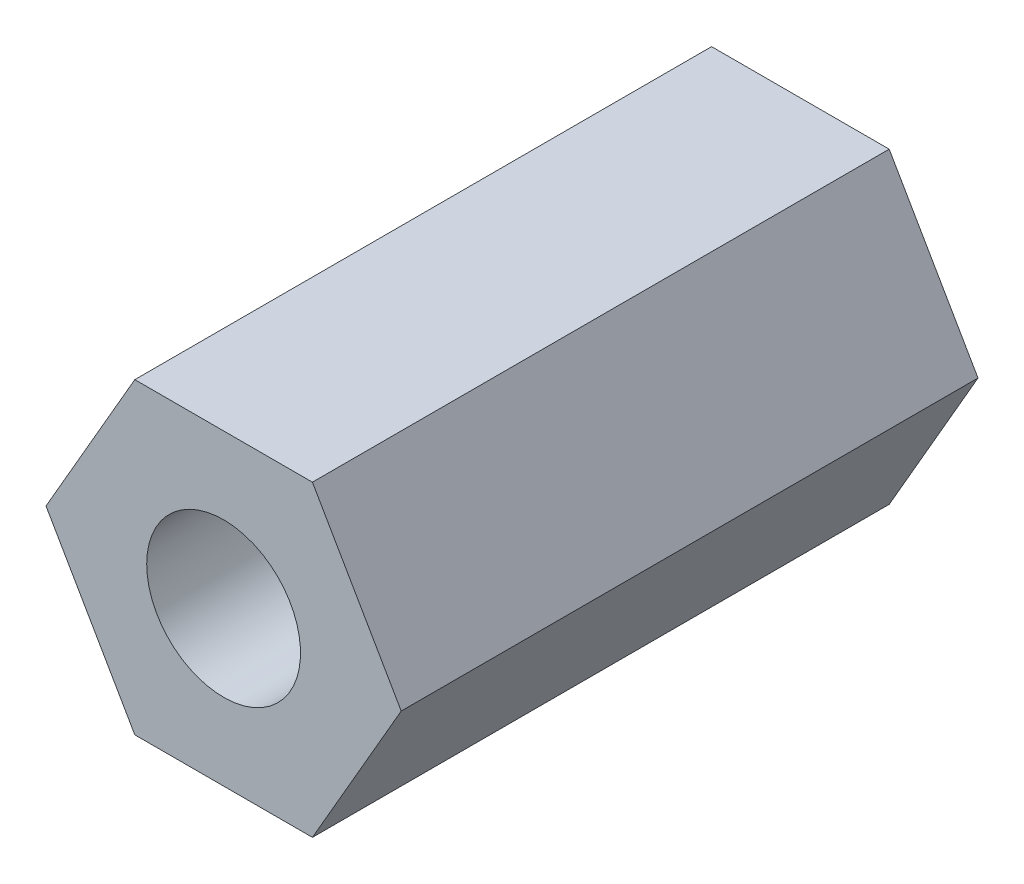
ISO-10303-21;
HEADER;
FILE_DESCRIPTION(('STEP AP214'),'2;1');
FILE_NAME('part.step','',(''),(''),'','','');
FILE_SCHEMA(('AUTOMOTIVE_DESIGN { 1 0 10303 214 1 1 1 1 }'));
ENDSEC;
DATA;
#1=APPLICATION_CONTEXT('core data for automotive mechanical design processes');
#2=APPLICATION_PROTOCOL_DEFINITION('international standard','automotive_design',2000,#1);
#3=PRODUCT_CONTEXT('',#1,'mechanical');
#4=PRODUCT('Part','Part','',(#3));
#5=PRODUCT_RELATED_PRODUCT_CATEGORY('part','',(#4));
#6=PRODUCT_DEFINITION_FORMATION('','',#4);
#7=PRODUCT_DEFINITION_CONTEXT('part definition',#1,'design');
#8=PRODUCT_DEFINITION('design','',#6,#7);
#9=PRODUCT_DEFINITION_SHAPE('','',#8);
#10=(LENGTH_UNIT() NAMED_UNIT(*) SI_UNIT(.MILLI.,.METRE.));
#11=(NAMED_UNIT(*) PLANE_ANGLE_UNIT() SI_UNIT($,.RADIAN.));
#12=(NAMED_UNIT(*) SI_UNIT($,.STERADIAN.) SOLID_ANGLE_UNIT());
#13=UNCERTAINTY_MEASURE_WITH_UNIT(LENGTH_MEASURE(1.E-05),#10,'distance_accuracy_value','');
#14=(GEOMETRIC_REPRESENTATION_CONTEXT(3) GLOBAL_UNCERTAINTY_ASSIGNED_CONTEXT((#13)) GLOBAL_UNIT_ASSIGNED_CONTEXT((#10,
#11,#12)) REPRESENTATION_CONTEXT('',''));
#15=CARTESIAN_POINT('',(0.,0.,0.));
#16=DIRECTION('',(0.,0.,1.));
#17=DIRECTION('',(1.,0.,0.));
#18=AXIS2_PLACEMENT_3D('',#15,#16,#17);
#19=CARTESIAN_POINT('',(-0.923760430703401,-1.6,6.));
#20=DIRECTION('',(0.,1.,0.));
#21=DIRECTION('',(-1.,0.,0.));
#22=AXIS2_PLACEMENT_3D('',#19,#20,#21);
#23=PLANE('',#22);
#24=DIRECTION('',(1.,0.,0.));
#25=VECTOR('',#24,1.);
#26=CARTESIAN_POINT('',(-0.923760430703401,-1.6,0.));
#27=LINE('',#26,#25);
#28=CARTESIAN_POINT('',(-0.923760430703401,-1.6,0.));
#29=VERTEX_POINT('',#28);
#30=CARTESIAN_POINT('',(0.923760430703402,-1.6,0.));
#31=VERTEX_POINT('',#30);
#32=EDGE_CURVE('E121',#29,#31,#27,.T.);
#33=ORIENTED_EDGE('',*,*,#32,.T.);
#34=DIRECTION('',(0.,0.,-1.));
#35=VECTOR('',#34,1.);
#36=CARTESIAN_POINT('',(0.923760430703402,-1.6,6.));
#37=LINE('',#36,#35);
#38=CARTESIAN_POINT('',(0.923760430703402,-1.6,6.));
#39=VERTEX_POINT('',#38);
#40=EDGE_CURVE('E11',#39,#31,#37,.T.);
#41=ORIENTED_EDGE('',*,*,#40,.F.);
#42=DIRECTION('',(1.,0.,0.));
#43=VECTOR('',#42,1.);
#44=CARTESIAN_POINT('',(-0.923760430703401,-1.6,6.));
#45=LINE('',#44,#43);
#46=CARTESIAN_POINT('',(-0.923760430703401,-1.6,6.));
#47=VERTEX_POINT('',#46);
#48=EDGE_CURVE('E132',#47,#39,#45,.T.);
#49=ORIENTED_EDGE('',*,*,#48,.F.);
#50=DIRECTION('',(0.,0.,-1.));
#51=VECTOR('',#50,1.);
#52=CARTESIAN_POINT('',(-0.923760430703401,-1.6,6.));
#53=LINE('',#52,#51);
#54=EDGE_CURVE('E117',#47,#29,#53,.T.);
#55=ORIENTED_EDGE('',*,*,#54,.T.);
#56=EDGE_LOOP('',(#33,#41,#49,#55));
#57=FACE_BOUND('',#56,.T.);
#58=ADVANCED_FACE('F37',(#57),#23,.F.);
#59=CARTESIAN_POINT('',(0.923760430703402,-1.6,6.));
#60=DIRECTION('',(-0.866025403784439,0.5,0.));
#61=DIRECTION('',(-0.5,-0.866025403784439,0.));
#62=AXIS2_PLACEMENT_3D('',#59,#60,#61);
#63=PLANE('',#62);
#64=DIRECTION('',(0.5,0.866025403784439,0.));
#65=VECTOR('',#64,1.);
#66=CARTESIAN_POINT('',(0.923760430703402,-1.6,0.));
#67=LINE('',#66,#65);
#68=CARTESIAN_POINT('',(1.8475208614068,0.,0.));
#69=VERTEX_POINT('',#68);
#70=EDGE_CURVE('E124',#31,#69,#67,.T.);
#71=ORIENTED_EDGE('',*,*,#70,.T.);
#72=DIRECTION('',(0.,0.,-1.));
#73=VECTOR('',#72,1.);
#74=CARTESIAN_POINT('',(1.8475208614068,0.,6.));
#75=LINE('',#74,#73);
#76=CARTESIAN_POINT('',(1.8475208614068,0.,6.));
#77=VERTEX_POINT('',#76);
#78=EDGE_CURVE('E45',#77,#69,#75,.T.);
#79=ORIENTED_EDGE('',*,*,#78,.F.);
#80=DIRECTION('',(0.5,0.866025403784439,0.));
#81=VECTOR('',#80,1.);
#82=CARTESIAN_POINT('',(0.923760430703402,-1.6,6.));
#83=LINE('',#82,#81);
#84=EDGE_CURVE('E90',#39,#77,#83,.T.);
#85=ORIENTED_EDGE('',*,*,#84,.F.);
#86=ORIENTED_EDGE('',*,*,#40,.T.);
#87=EDGE_LOOP('',(#71,#79,#85,#86));
#88=FACE_BOUND('',#87,.T.);
#89=ADVANCED_FACE('F157',(#88),#63,.F.);
#90=CARTESIAN_POINT('',(1.8475208614068,0.,6.));
#91=DIRECTION('',(-0.866025403784438,-0.5,0.));
#92=DIRECTION('',(0.5,-0.866025403784439,0.));
#93=AXIS2_PLACEMENT_3D('',#90,#91,#92);
#94=PLANE('',#93);
#95=DIRECTION('',(-0.5,0.866025403784439,0.));
#96=VECTOR('',#95,1.);
#97=CARTESIAN_POINT('',(1.8475208614068,0.,0.));
#98=LINE('',#97,#96);
#99=CARTESIAN_POINT('',(0.923760430703402,1.6,0.));
#100=VERTEX_POINT('',#99);
#101=EDGE_CURVE('E127',#69,#100,#98,.T.);
#102=ORIENTED_EDGE('',*,*,#101,.T.);
#103=DIRECTION('',(0.,0.,-1.));
#104=VECTOR('',#103,1.);
#105=CARTESIAN_POINT('',(0.923760430703402,1.6,6.));
#106=LINE('',#105,#104);
#107=CARTESIAN_POINT('',(0.923760430703402,1.6,6.));
#108=VERTEX_POINT('',#107);
#109=EDGE_CURVE('E112',#108,#100,#106,.T.);
#110=ORIENTED_EDGE('',*,*,#109,.F.);
#111=DIRECTION('',(-0.5,0.866025403784439,0.));
#112=VECTOR('',#111,1.);
#113=CARTESIAN_POINT('',(1.8475208614068,0.,6.));
#114=LINE('',#113,#112);
#115=EDGE_CURVE('E103',#77,#108,#114,.T.);
#116=ORIENTED_EDGE('',*,*,#115,.F.);
#117=ORIENTED_EDGE('',*,*,#78,.T.);
#118=EDGE_LOOP('',(#102,#110,#116,#117));
#119=FACE_BOUND('',#118,.T.);
#120=ADVANCED_FACE('F138',(#119),#94,.F.);
#121=CARTESIAN_POINT('',(0.923760430703402,1.6,6.));
#122=DIRECTION('',(0.,-1.,0.));
#123=DIRECTION('',(1.,0.,0.));
#124=AXIS2_PLACEMENT_3D('',#121,#122,#123);
#125=PLANE('',#124);
#126=DIRECTION('',(-1.,0.,0.));
#127=VECTOR('',#126,1.);
#128=CARTESIAN_POINT('',(0.923760430703402,1.6,0.));
#129=LINE('',#128,#127);
#130=CARTESIAN_POINT('',(-0.923760430703402,1.6,0.));
#131=VERTEX_POINT('',#130);
#132=EDGE_CURVE('E111',#100,#131,#129,.T.);
#133=ORIENTED_EDGE('',*,*,#132,.T.);
#134=DIRECTION('',(0.,0.,-1.));
#135=VECTOR('',#134,1.);
#136=CARTESIAN_POINT('',(-0.923760430703402,1.6,6.));
#137=LINE('',#136,#135);
#138=CARTESIAN_POINT('',(-0.923760430703402,1.6,6.));
#139=VERTEX_POINT('',#138);
#140=EDGE_CURVE('E108',#139,#131,#137,.T.);
#141=ORIENTED_EDGE('',*,*,#140,.F.);
#142=DIRECTION('',(-1.,0.,0.));
#143=VECTOR('',#142,1.);
#144=CARTESIAN_POINT('',(0.923760430703402,1.6,6.));
#145=LINE('',#144,#143);
#146=EDGE_CURVE('E97',#108,#139,#145,.T.);
#147=ORIENTED_EDGE('',*,*,#146,.F.);
#148=ORIENTED_EDGE('',*,*,#109,.T.);
#149=EDGE_LOOP('',(#133,#141,#147,#148));
#150=FACE_BOUND('',#149,.T.);
#151=ADVANCED_FACE('F109',(#150),#125,.F.);
#152=CARTESIAN_POINT('',(-0.923760430703402,1.6,6.));
#153=DIRECTION('',(0.866025403784439,-0.5,0.));
#154=DIRECTION('',(0.5,0.866025403784439,0.));
#155=AXIS2_PLACEMENT_3D('',#152,#153,#154);
#156=PLANE('',#155);
#157=DIRECTION('',(-0.5,-0.866025403784439,0.));
#158=VECTOR('',#157,1.);
#159=CARTESIAN_POINT('',(-0.923760430703402,1.6,0.));
#160=LINE('',#159,#158);
#161=CARTESIAN_POINT('',(-1.8475208614068,0.,0.));
#162=VERTEX_POINT('',#161);
#163=EDGE_CURVE('E76',#131,#162,#160,.T.);
#164=ORIENTED_EDGE('',*,*,#163,.T.);
#165=DIRECTION('',(0.,0.,-1.));
#166=VECTOR('',#165,1.);
#167=CARTESIAN_POINT('',(-1.8475208614068,0.,6.));
#168=LINE('',#167,#166);
#169=CARTESIAN_POINT('',(-1.8475208614068,0.,6.));
#170=VERTEX_POINT('',#169);
#171=EDGE_CURVE('E113',#170,#162,#168,.T.);
#172=ORIENTED_EDGE('',*,*,#171,.F.);
#173=DIRECTION('',(-0.5,-0.866025403784439,0.));
#174=VECTOR('',#173,1.);
#175=CARTESIAN_POINT('',(-0.923760430703402,1.6,6.));
#176=LINE('',#175,#174);
#177=EDGE_CURVE('E101',#139,#170,#176,.T.);
#178=ORIENTED_EDGE('',*,*,#177,.F.);
#179=ORIENTED_EDGE('',*,*,#140,.T.);
#180=EDGE_LOOP('',(#164,#172,#178,#179));
#181=FACE_BOUND('',#180,.T.);
#182=ADVANCED_FACE('F115',(#181),#156,.F.);
#183=CARTESIAN_POINT('',(-1.8475208614068,0.,6.));
#184=DIRECTION('',(0.866025403784439,0.5,0.));
#185=DIRECTION('',(-0.5,0.866025403784439,0.));
#186=AXIS2_PLACEMENT_3D('',#183,#184,#185);
#187=PLANE('',#186);
#188=DIRECTION('',(0.5,-0.866025403784439,0.));
#189=VECTOR('',#188,1.);
#190=CARTESIAN_POINT('',(-1.8475208614068,0.,0.));
#191=LINE('',#190,#189);
#192=EDGE_CURVE('E82',#162,#29,#191,.T.);
#193=ORIENTED_EDGE('',*,*,#192,.T.);
#194=ORIENTED_EDGE('',*,*,#54,.F.);
#195=DIRECTION('',(0.5,-0.866025403784439,0.));
#196=VECTOR('',#195,1.);
#197=CARTESIAN_POINT('',(-1.8475208614068,0.,6.));
#198=LINE('',#197,#196);
#199=EDGE_CURVE('E53',#170,#47,#198,.T.);
#200=ORIENTED_EDGE('',*,*,#199,.F.);
#201=ORIENTED_EDGE('',*,*,#171,.T.);
#202=EDGE_LOOP('',(#193,#194,#200,#201));
#203=FACE_BOUND('',#202,.T.);
#204=ADVANCED_FACE('F145',(#203),#187,.F.);
#205=CARTESIAN_POINT('',(-2.7712812921102,-1.6,6.));
#206=DIRECTION('',(0.,0.,-1.));
#207=DIRECTION('',(-1.,0.,0.));
#208=AXIS2_PLACEMENT_3D('',#205,#206,#207);
#209=PLANE('',#208);
#210=CARTESIAN_POINT('',(0.,0.,6.));
#211=DIRECTION('',(0.,0.,-1.));
#212=DIRECTION('',(-1.,0.,0.));
#213=AXIS2_PLACEMENT_3D('',#210,#211,#212);
#214=CIRCLE('',#213,0.799999999999998);
#215=CARTESIAN_POINT('',(-0.799999999999998,0.,6.));
#216=VERTEX_POINT('',#215);
#217=EDGE_CURVE('E214',#216,#216,#214,.T.);
#218=ORIENTED_EDGE('',*,*,#217,.T.);
#219=EDGE_LOOP('',(#218));
#220=FACE_BOUND('',#219,.T.);
#221=ORIENTED_EDGE('',*,*,#48,.T.);
#222=ORIENTED_EDGE('',*,*,#84,.T.);
#223=ORIENTED_EDGE('',*,*,#115,.T.);
#224=ORIENTED_EDGE('',*,*,#146,.T.);
#225=ORIENTED_EDGE('',*,*,#177,.T.);
#226=ORIENTED_EDGE('',*,*,#199,.T.);
#227=EDGE_LOOP('',(#221,#222,#223,#224,#225,#226));
#228=FACE_BOUND('',#227,.T.);
#229=ADVANCED_FACE('F99',(#220,#228),#209,.F.);
#230=CARTESIAN_POINT('',(-2.7712812921102,-1.6,0.));
#231=DIRECTION('',(0.,0.,-1.));
#232=DIRECTION('',(-1.,0.,0.));
#233=AXIS2_PLACEMENT_3D('',#230,#231,#232);
#234=PLANE('',#233);
#235=CARTESIAN_POINT('',(0.,0.,0.));
#236=DIRECTION('',(0.,0.,-1.));
#237=DIRECTION('',(-1.,0.,0.));
#238=AXIS2_PLACEMENT_3D('',#235,#236,#237);
#239=CIRCLE('',#238,0.799999999999999);
#240=CARTESIAN_POINT('',(-0.799999999999999,0.,0.));
#241=VERTEX_POINT('',#240);
#242=EDGE_CURVE('E125',#241,#241,#239,.T.);
#243=ORIENTED_EDGE('',*,*,#242,.F.);
#244=EDGE_LOOP('',(#243));
#245=FACE_BOUND('',#244,.T.);
#246=ORIENTED_EDGE('',*,*,#32,.F.);
#247=ORIENTED_EDGE('',*,*,#192,.F.);
#248=ORIENTED_EDGE('',*,*,#163,.F.);
#249=ORIENTED_EDGE('',*,*,#132,.F.);
#250=ORIENTED_EDGE('',*,*,#101,.F.);
#251=ORIENTED_EDGE('',*,*,#70,.F.);
#252=EDGE_LOOP('',(#246,#247,#248,#249,#250,#251));
#253=FACE_BOUND('',#252,.T.);
#254=ADVANCED_FACE('F141',(#245,#253),#234,.T.);
#255=CARTESIAN_POINT('',(0.,0.,0.));
#256=DIRECTION('',(0.,0.,-1.));
#257=DIRECTION('',(-1.,0.,0.));
#258=AXIS2_PLACEMENT_3D('',#255,#256,#257);
#259=CYLINDRICAL_SURFACE('',#258,0.799999999999999);
#260=ORIENTED_EDGE('',*,*,#217,.F.);
#261=EDGE_LOOP('',(#260));
#262=FACE_BOUND('',#261,.T.);
#263=ORIENTED_EDGE('',*,*,#242,.T.);
#264=EDGE_LOOP('',(#263));
#265=FACE_BOUND('',#264,.T.);
#266=ADVANCED_FACE('F194',(#262,#265),#259,.F.);
#267=CLOSED_SHELL('',(#58,#89,#120,#151,#182,#204,#229,#254,#266));
#268=MANIFOLD_SOLID_BREP('B2',#267);
#269=ADVANCED_BREP_SHAPE_REPRESENTATION('',(#18,#268),#14);
#270=SHAPE_DEFINITION_REPRESENTATION(#9,#269);
ENDSEC;
END-ISO-10303-21;
